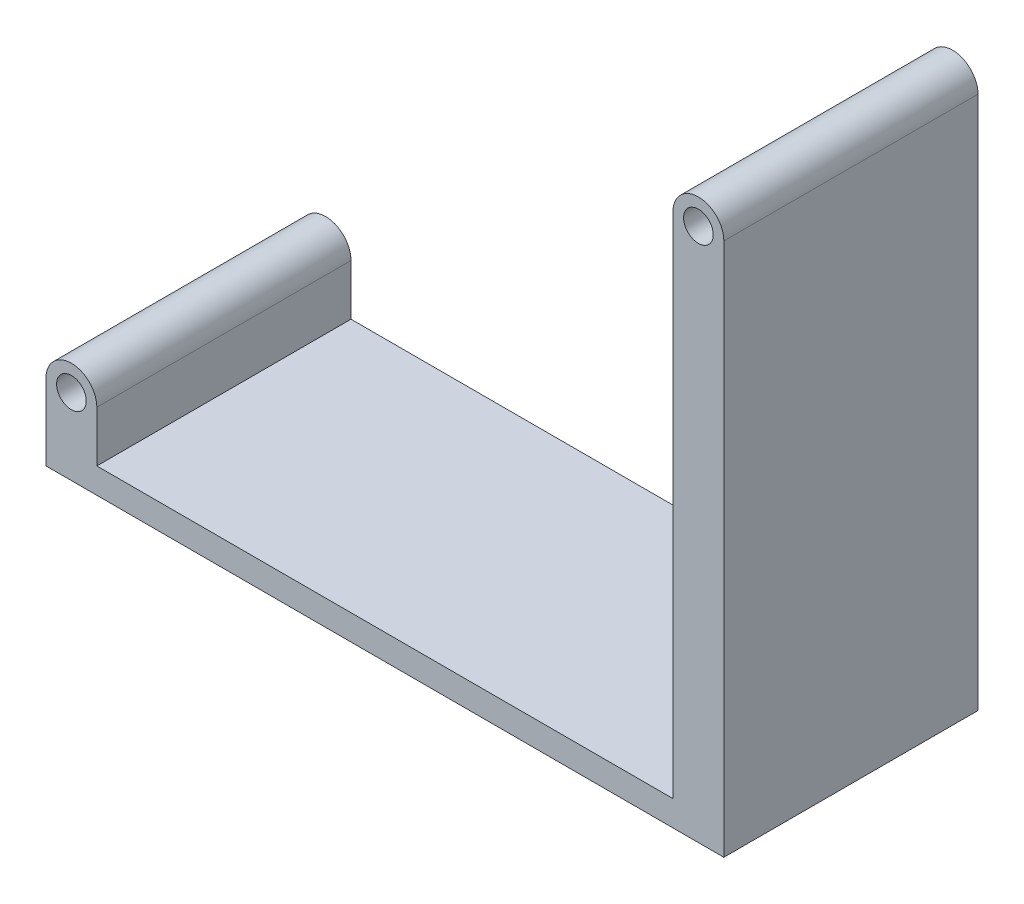
ISO-10303-21;
HEADER;
FILE_DESCRIPTION(('STEP AP214'),'2;1');
FILE_NAME('part.step','',(''),(''),'','','');
FILE_SCHEMA(('AUTOMOTIVE_DESIGN { 1 0 10303 214 1 1 1 1 }'));
ENDSEC;
DATA;
#1=APPLICATION_CONTEXT('core data for automotive mechanical design processes');
#2=APPLICATION_PROTOCOL_DEFINITION('international standard','automotive_design',2000,#1);
#3=PRODUCT_CONTEXT('',#1,'mechanical');
#4=PRODUCT('Part','Part','',(#3));
#5=PRODUCT_RELATED_PRODUCT_CATEGORY('part','',(#4));
#6=PRODUCT_DEFINITION_FORMATION('','',#4);
#7=PRODUCT_DEFINITION_CONTEXT('part definition',#1,'design');
#8=PRODUCT_DEFINITION('design','',#6,#7);
#9=PRODUCT_DEFINITION_SHAPE('','',#8);
#10=(LENGTH_UNIT() NAMED_UNIT(*) SI_UNIT(.MILLI.,.METRE.));
#11=(NAMED_UNIT(*) PLANE_ANGLE_UNIT() SI_UNIT($,.RADIAN.));
#12=(NAMED_UNIT(*) SI_UNIT($,.STERADIAN.) SOLID_ANGLE_UNIT());
#13=UNCERTAINTY_MEASURE_WITH_UNIT(LENGTH_MEASURE(1.E-05),#10,'distance_accuracy_value','');
#14=(GEOMETRIC_REPRESENTATION_CONTEXT(3) GLOBAL_UNCERTAINTY_ASSIGNED_CONTEXT((#13)) GLOBAL_UNIT_ASSIGNED_CONTEXT((#10,
#11,#12)) REPRESENTATION_CONTEXT('',''));
#15=CARTESIAN_POINT('',(0.,0.,0.));
#16=DIRECTION('',(0.,0.,1.));
#17=DIRECTION('',(1.,0.,0.));
#18=AXIS2_PLACEMENT_3D('',#15,#16,#17);
#19=CARTESIAN_POINT('',(77.,63.,30.));
#20=DIRECTION('',(0.,0.,-1.));
#21=DIRECTION('',(-1.,0.,0.));
#22=AXIS2_PLACEMENT_3D('',#19,#20,#21);
#23=CYLINDRICAL_SURFACE('',#22,3.00000000000001);
#24=CARTESIAN_POINT('',(77.,63.,0.));
#25=DIRECTION('',(0.,0.,1.));
#26=DIRECTION('',(1.,0.,0.));
#27=AXIS2_PLACEMENT_3D('',#24,#25,#26);
#28=CIRCLE('',#27,3.00000000000001);
#29=CARTESIAN_POINT('',(80.,63.,0.));
#30=VERTEX_POINT('',#29);
#31=CARTESIAN_POINT('',(74.,63.,0.));
#32=VERTEX_POINT('',#31);
#33=EDGE_CURVE('E153',#30,#32,#28,.T.);
#34=ORIENTED_EDGE('',*,*,#33,.T.);
#35=DIRECTION('',(0.,0.,-1.));
#36=VECTOR('',#35,1.);
#37=CARTESIAN_POINT('',(74.,63.,30.));
#38=LINE('',#37,#36);
#39=CARTESIAN_POINT('',(74.,63.,30.));
#40=VERTEX_POINT('',#39);
#41=EDGE_CURVE('E11',#40,#32,#38,.T.);
#42=ORIENTED_EDGE('',*,*,#41,.F.);
#43=CARTESIAN_POINT('',(77.,63.,30.));
#44=DIRECTION('',(0.,0.,1.));
#45=DIRECTION('',(1.,0.,0.));
#46=AXIS2_PLACEMENT_3D('',#43,#44,#45);
#47=CIRCLE('',#46,3.00000000000001);
#48=CARTESIAN_POINT('',(80.,63.,30.));
#49=VERTEX_POINT('',#48);
#50=EDGE_CURVE('E98',#49,#40,#47,.T.);
#51=ORIENTED_EDGE('',*,*,#50,.F.);
#52=DIRECTION('',(0.,0.,-1.));
#53=VECTOR('',#52,1.);
#54=CARTESIAN_POINT('',(80.,63.,30.));
#55=LINE('',#54,#53);
#56=EDGE_CURVE('E148',#49,#30,#55,.T.);
#57=ORIENTED_EDGE('',*,*,#56,.T.);
#58=EDGE_LOOP('',(#34,#42,#51,#57));
#59=FACE_BOUND('',#58,.T.);
#60=ADVANCED_FACE('F41',(#59),#23,.T.);
#61=CARTESIAN_POINT('',(74.,0.,30.));
#62=DIRECTION('',(-1.,0.,0.));
#63=DIRECTION('',(0.,-1.,0.));
#64=AXIS2_PLACEMENT_3D('',#61,#62,#63);
#65=PLANE('',#64);
#66=DIRECTION('',(0.,1.,0.));
#67=VECTOR('',#66,1.);
#68=CARTESIAN_POINT('',(74.,0.,0.));
#69=LINE('',#68,#67);
#70=CARTESIAN_POINT('',(74.,3.,0.));
#71=VERTEX_POINT('',#70);
#72=EDGE_CURVE('E157',#71,#32,#69,.T.);
#73=ORIENTED_EDGE('',*,*,#72,.F.);
#74=DIRECTION('',(0.,0.,-1.));
#75=VECTOR('',#74,1.);
#76=CARTESIAN_POINT('',(74.,3.,30.));
#77=LINE('',#76,#75);
#78=CARTESIAN_POINT('',(74.,3.,30.));
#79=VERTEX_POINT('',#78);
#80=EDGE_CURVE('E51',#79,#71,#77,.T.);
#81=ORIENTED_EDGE('',*,*,#80,.F.);
#82=DIRECTION('',(0.,1.,0.));
#83=VECTOR('',#82,1.);
#84=CARTESIAN_POINT('',(74.,0.,30.));
#85=LINE('',#84,#83);
#86=EDGE_CURVE('E341',#79,#40,#85,.T.);
#87=ORIENTED_EDGE('',*,*,#86,.T.);
#88=ORIENTED_EDGE('',*,*,#41,.T.);
#89=EDGE_LOOP('',(#73,#81,#87,#88));
#90=FACE_BOUND('',#89,.T.);
#91=ADVANCED_FACE('F205',(#90),#65,.T.);
#92=CARTESIAN_POINT('',(0.,3.,30.));
#93=DIRECTION('',(0.,1.,0.));
#94=DIRECTION('',(-1.,0.,0.));
#95=AXIS2_PLACEMENT_3D('',#92,#93,#94);
#96=PLANE('',#95);
#97=DIRECTION('',(1.,0.,0.));
#98=VECTOR('',#97,1.);
#99=CARTESIAN_POINT('',(0.,3.,0.));
#100=LINE('',#99,#98);
#101=CARTESIAN_POINT('',(6.,3.,0.));
#102=VERTEX_POINT('',#101);
#103=EDGE_CURVE('E161',#102,#71,#100,.T.);
#104=ORIENTED_EDGE('',*,*,#103,.F.);
#105=DIRECTION('',(0.,0.,-1.));
#106=VECTOR('',#105,1.);
#107=CARTESIAN_POINT('',(6.,3.,30.));
#108=LINE('',#107,#106);
#109=CARTESIAN_POINT('',(6.,3.,30.));
#110=VERTEX_POINT('',#109);
#111=EDGE_CURVE('E193',#110,#102,#108,.T.);
#112=ORIENTED_EDGE('',*,*,#111,.F.);
#113=DIRECTION('',(1.,0.,0.));
#114=VECTOR('',#113,1.);
#115=CARTESIAN_POINT('',(0.,3.,30.));
#116=LINE('',#115,#114);
#117=EDGE_CURVE('E202',#110,#79,#116,.T.);
#118=ORIENTED_EDGE('',*,*,#117,.T.);
#119=ORIENTED_EDGE('',*,*,#80,.T.);
#120=EDGE_LOOP('',(#104,#112,#118,#119));
#121=FACE_BOUND('',#120,.T.);
#122=ADVANCED_FACE('F200',(#121),#96,.T.);
#123=CARTESIAN_POINT('',(6.,0.,30.));
#124=DIRECTION('',(-1.,0.,0.));
#125=DIRECTION('',(0.,-1.,0.));
#126=AXIS2_PLACEMENT_3D('',#123,#124,#125);
#127=PLANE('',#126);
#128=DIRECTION('',(0.,1.,0.));
#129=VECTOR('',#128,1.);
#130=CARTESIAN_POINT('',(6.,0.,0.));
#131=LINE('',#130,#129);
#132=CARTESIAN_POINT('',(6.,9.,0.));
#133=VERTEX_POINT('',#132);
#134=EDGE_CURVE('E165',#102,#133,#131,.T.);
#135=ORIENTED_EDGE('',*,*,#134,.T.);
#136=DIRECTION('',(0.,0.,-1.));
#137=VECTOR('',#136,1.);
#138=CARTESIAN_POINT('',(6.,9.,30.));
#139=LINE('',#138,#137);
#140=CARTESIAN_POINT('',(6.,9.,30.));
#141=VERTEX_POINT('',#140);
#142=EDGE_CURVE('E189',#141,#133,#139,.T.);
#143=ORIENTED_EDGE('',*,*,#142,.F.);
#144=DIRECTION('',(0.,1.,0.));
#145=VECTOR('',#144,1.);
#146=CARTESIAN_POINT('',(6.,0.,30.));
#147=LINE('',#146,#145);
#148=EDGE_CURVE('E138',#110,#141,#147,.T.);
#149=ORIENTED_EDGE('',*,*,#148,.F.);
#150=ORIENTED_EDGE('',*,*,#111,.T.);
#151=EDGE_LOOP('',(#135,#143,#149,#150));
#152=FACE_BOUND('',#151,.T.);
#153=ADVANCED_FACE('F214',(#152),#127,.F.);
#154=CARTESIAN_POINT('',(3.,9.,30.));
#155=DIRECTION('',(0.,0.,-1.));
#156=DIRECTION('',(-1.,0.,0.));
#157=AXIS2_PLACEMENT_3D('',#154,#155,#156);
#158=CYLINDRICAL_SURFACE('',#157,3.);
#159=CARTESIAN_POINT('',(3.,9.,0.));
#160=DIRECTION('',(0.,0.,1.));
#161=DIRECTION('',(1.,0.,0.));
#162=AXIS2_PLACEMENT_3D('',#159,#160,#161);
#163=CIRCLE('',#162,3.);
#164=CARTESIAN_POINT('',(0.,9.,0.));
#165=VERTEX_POINT('',#164);
#166=EDGE_CURVE('E168',#133,#165,#163,.T.);
#167=ORIENTED_EDGE('',*,*,#166,.T.);
#168=DIRECTION('',(0.,0.,-1.));
#169=VECTOR('',#168,1.);
#170=CARTESIAN_POINT('',(0.,9.,30.));
#171=LINE('',#170,#169);
#172=CARTESIAN_POINT('',(0.,9.,30.));
#173=VERTEX_POINT('',#172);
#174=EDGE_CURVE('E123',#173,#165,#171,.T.);
#175=ORIENTED_EDGE('',*,*,#174,.F.);
#176=CARTESIAN_POINT('',(3.,9.,30.));
#177=DIRECTION('',(0.,0.,1.));
#178=DIRECTION('',(1.,0.,0.));
#179=AXIS2_PLACEMENT_3D('',#176,#177,#178);
#180=CIRCLE('',#179,3.);
#181=EDGE_CURVE('E133',#141,#173,#180,.T.);
#182=ORIENTED_EDGE('',*,*,#181,.F.);
#183=ORIENTED_EDGE('',*,*,#142,.T.);
#184=EDGE_LOOP('',(#167,#175,#182,#183));
#185=FACE_BOUND('',#184,.T.);
#186=ADVANCED_FACE('F217',(#185),#158,.T.);
#187=CARTESIAN_POINT('',(0.,0.,30.));
#188=DIRECTION('',(-1.,0.,0.));
#189=DIRECTION('',(0.,0.,1.));
#190=AXIS2_PLACEMENT_3D('',#187,#188,#189);
#191=PLANE('',#190);
#192=DIRECTION('',(0.,1.,0.));
#193=VECTOR('',#192,1.);
#194=CARTESIAN_POINT('',(0.,0.,0.));
#195=LINE('',#194,#193);
#196=CARTESIAN_POINT('',(0.,0.,0.));
#197=VERTEX_POINT('',#196);
#198=EDGE_CURVE('E121',#197,#165,#195,.T.);
#199=ORIENTED_EDGE('',*,*,#198,.F.);
#200=DIRECTION('',(0.,0.,-1.));
#201=VECTOR('',#200,1.);
#202=CARTESIAN_POINT('',(0.,0.,30.));
#203=LINE('',#202,#201);
#204=CARTESIAN_POINT('',(0.,0.,30.));
#205=VERTEX_POINT('',#204);
#206=EDGE_CURVE('E115',#205,#197,#203,.T.);
#207=ORIENTED_EDGE('',*,*,#206,.F.);
#208=DIRECTION('',(0.,1.,0.));
#209=VECTOR('',#208,1.);
#210=CARTESIAN_POINT('',(0.,0.,30.));
#211=LINE('',#210,#209);
#212=EDGE_CURVE('E119',#205,#173,#211,.T.);
#213=ORIENTED_EDGE('',*,*,#212,.T.);
#214=ORIENTED_EDGE('',*,*,#174,.T.);
#215=EDGE_LOOP('',(#199,#207,#213,#214));
#216=FACE_BOUND('',#215,.T.);
#217=ADVANCED_FACE('F117',(#216),#191,.T.);
#218=CARTESIAN_POINT('',(0.,0.,30.));
#219=DIRECTION('',(0.,1.,0.));
#220=DIRECTION('',(0.,0.,1.));
#221=AXIS2_PLACEMENT_3D('',#218,#219,#220);
#222=PLANE('',#221);
#223=DIRECTION('',(1.,0.,0.));
#224=VECTOR('',#223,1.);
#225=CARTESIAN_POINT('',(0.,0.,0.));
#226=LINE('',#225,#224);
#227=CARTESIAN_POINT('',(80.,0.,0.));
#228=VERTEX_POINT('',#227);
#229=EDGE_CURVE('E86',#197,#228,#226,.T.);
#230=ORIENTED_EDGE('',*,*,#229,.T.);
#231=DIRECTION('',(0.,0.,-1.));
#232=VECTOR('',#231,1.);
#233=CARTESIAN_POINT('',(80.,0.,30.));
#234=LINE('',#233,#232);
#235=CARTESIAN_POINT('',(80.,0.,30.));
#236=VERTEX_POINT('',#235);
#237=EDGE_CURVE('E124',#236,#228,#234,.T.);
#238=ORIENTED_EDGE('',*,*,#237,.F.);
#239=DIRECTION('',(1.,0.,0.));
#240=VECTOR('',#239,1.);
#241=CARTESIAN_POINT('',(0.,0.,30.));
#242=LINE('',#241,#240);
#243=EDGE_CURVE('E126',#205,#236,#242,.T.);
#244=ORIENTED_EDGE('',*,*,#243,.F.);
#245=ORIENTED_EDGE('',*,*,#206,.T.);
#246=EDGE_LOOP('',(#230,#238,#244,#245));
#247=FACE_BOUND('',#246,.T.);
#248=ADVANCED_FACE('F127',(#247),#222,.F.);
#249=CARTESIAN_POINT('',(80.,0.,30.));
#250=DIRECTION('',(-1.,0.,0.));
#251=DIRECTION('',(0.,-1.,0.));
#252=AXIS2_PLACEMENT_3D('',#249,#250,#251);
#253=PLANE('',#252);
#254=DIRECTION('',(0.,1.,0.));
#255=VECTOR('',#254,1.);
#256=CARTESIAN_POINT('',(80.,0.,0.));
#257=LINE('',#256,#255);
#258=EDGE_CURVE('E92',#228,#30,#257,.T.);
#259=ORIENTED_EDGE('',*,*,#258,.T.);
#260=ORIENTED_EDGE('',*,*,#56,.F.);
#261=DIRECTION('',(0.,1.,0.));
#262=VECTOR('',#261,1.);
#263=CARTESIAN_POINT('',(80.,0.,30.));
#264=LINE('',#263,#262);
#265=EDGE_CURVE('E59',#236,#49,#264,.T.);
#266=ORIENTED_EDGE('',*,*,#265,.F.);
#267=ORIENTED_EDGE('',*,*,#237,.T.);
#268=EDGE_LOOP('',(#259,#260,#266,#267));
#269=FACE_BOUND('',#268,.T.);
#270=ADVANCED_FACE('F219',(#269),#253,.F.);
#271=CARTESIAN_POINT('',(3.,9.,30.));
#272=DIRECTION('',(0.,0.,-1.));
#273=DIRECTION('',(-1.,0.,0.));
#274=AXIS2_PLACEMENT_3D('',#271,#272,#273);
#275=CYLINDRICAL_SURFACE('',#274,1.75);
#276=CARTESIAN_POINT('',(3.,9.,30.));
#277=DIRECTION('',(0.,0.,1.));
#278=DIRECTION('',(1.,0.,0.));
#279=AXIS2_PLACEMENT_3D('',#276,#277,#278);
#280=CIRCLE('',#279,1.75);
#281=CARTESIAN_POINT('',(4.75,9.,30.));
#282=VERTEX_POINT('',#281);
#283=EDGE_CURVE('E182',#282,#282,#280,.T.);
#284=ORIENTED_EDGE('',*,*,#283,.T.);
#285=EDGE_LOOP('',(#284));
#286=FACE_BOUND('',#285,.T.);
#287=CARTESIAN_POINT('',(3.,9.,0.));
#288=DIRECTION('',(0.,0.,1.));
#289=DIRECTION('',(1.,0.,0.));
#290=AXIS2_PLACEMENT_3D('',#287,#288,#289);
#291=CIRCLE('',#290,1.75);
#292=CARTESIAN_POINT('',(4.75,9.,0.));
#293=VERTEX_POINT('',#292);
#294=EDGE_CURVE('E149',#293,#293,#291,.T.);
#295=ORIENTED_EDGE('',*,*,#294,.F.);
#296=EDGE_LOOP('',(#295));
#297=FACE_BOUND('',#296,.T.);
#298=ADVANCED_FACE('F43',(#286,#297),#275,.F.);
#299=CARTESIAN_POINT('',(77.,63.,30.));
#300=DIRECTION('',(0.,0.,-1.));
#301=DIRECTION('',(-1.,0.,0.));
#302=AXIS2_PLACEMENT_3D('',#299,#300,#301);
#303=CYLINDRICAL_SURFACE('',#302,1.75);
#304=CARTESIAN_POINT('',(77.,63.,30.));
#305=DIRECTION('',(0.,0.,1.));
#306=DIRECTION('',(1.,0.,0.));
#307=AXIS2_PLACEMENT_3D('',#304,#305,#306);
#308=CIRCLE('',#307,1.75);
#309=CARTESIAN_POINT('',(78.75,63.,30.));
#310=VERTEX_POINT('',#309);
#311=EDGE_CURVE('E144',#310,#310,#308,.T.);
#312=ORIENTED_EDGE('',*,*,#311,.T.);
#313=EDGE_LOOP('',(#312));
#314=FACE_BOUND('',#313,.T.);
#315=CARTESIAN_POINT('',(77.,63.,0.));
#316=DIRECTION('',(0.,0.,1.));
#317=DIRECTION('',(1.,0.,0.));
#318=AXIS2_PLACEMENT_3D('',#315,#316,#317);
#319=CIRCLE('',#318,1.75);
#320=CARTESIAN_POINT('',(78.75,63.,0.));
#321=VERTEX_POINT('',#320);
#322=EDGE_CURVE('E178',#321,#321,#319,.T.);
#323=ORIENTED_EDGE('',*,*,#322,.F.);
#324=EDGE_LOOP('',(#323));
#325=FACE_BOUND('',#324,.T.);
#326=ADVANCED_FACE('F226',(#314,#325),#303,.F.);
#327=CARTESIAN_POINT('',(0.,0.,30.));
#328=DIRECTION('',(0.,0.,1.));
#329=DIRECTION('',(1.,0.,0.));
#330=AXIS2_PLACEMENT_3D('',#327,#328,#329);
#331=PLANE('',#330);
#332=ORIENTED_EDGE('',*,*,#283,.F.);
#333=EDGE_LOOP('',(#332));
#334=FACE_BOUND('',#333,.T.);
#335=ORIENTED_EDGE('',*,*,#50,.T.);
#336=ORIENTED_EDGE('',*,*,#86,.F.);
#337=ORIENTED_EDGE('',*,*,#117,.F.);
#338=ORIENTED_EDGE('',*,*,#148,.T.);
#339=ORIENTED_EDGE('',*,*,#181,.T.);
#340=ORIENTED_EDGE('',*,*,#212,.F.);
#341=ORIENTED_EDGE('',*,*,#243,.T.);
#342=ORIENTED_EDGE('',*,*,#265,.T.);
#343=EDGE_LOOP('',(#335,#336,#337,#338,#339,#340,#341,#342));
#344=FACE_BOUND('',#343,.T.);
#345=ORIENTED_EDGE('',*,*,#311,.F.);
#346=EDGE_LOOP('',(#345));
#347=FACE_BOUND('',#346,.T.);
#348=ADVANCED_FACE('F130',(#334,#344,#347),#331,.T.);
#349=CARTESIAN_POINT('',(0.,0.,0.));
#350=DIRECTION('',(0.,0.,1.));
#351=DIRECTION('',(1.,0.,0.));
#352=AXIS2_PLACEMENT_3D('',#349,#350,#351);
#353=PLANE('',#352);
#354=ORIENTED_EDGE('',*,*,#294,.T.);
#355=EDGE_LOOP('',(#354));
#356=FACE_BOUND('',#355,.T.);
#357=ORIENTED_EDGE('',*,*,#33,.F.);
#358=ORIENTED_EDGE('',*,*,#258,.F.);
#359=ORIENTED_EDGE('',*,*,#229,.F.);
#360=ORIENTED_EDGE('',*,*,#198,.T.);
#361=ORIENTED_EDGE('',*,*,#166,.F.);
#362=ORIENTED_EDGE('',*,*,#134,.F.);
#363=ORIENTED_EDGE('',*,*,#103,.T.);
#364=ORIENTED_EDGE('',*,*,#72,.T.);
#365=EDGE_LOOP('',(#357,#358,#359,#360,#361,#362,#363,#364));
#366=FACE_BOUND('',#365,.T.);
#367=ORIENTED_EDGE('',*,*,#322,.T.);
#368=EDGE_LOOP('',(#367));
#369=FACE_BOUND('',#368,.T.);
#370=ADVANCED_FACE('F209',(#356,#366,#369),#353,.F.);
#371=CLOSED_SHELL('',(#60,#91,#122,#153,#186,#217,#248,#270,#298,#326,#348,#370));
#372=MANIFOLD_SOLID_BREP('B2',#371);
#373=ADVANCED_BREP_SHAPE_REPRESENTATION('',(#18,#372),#14);
#374=SHAPE_DEFINITION_REPRESENTATION(#9,#373);
ENDSEC;
END-ISO-10303-21;
